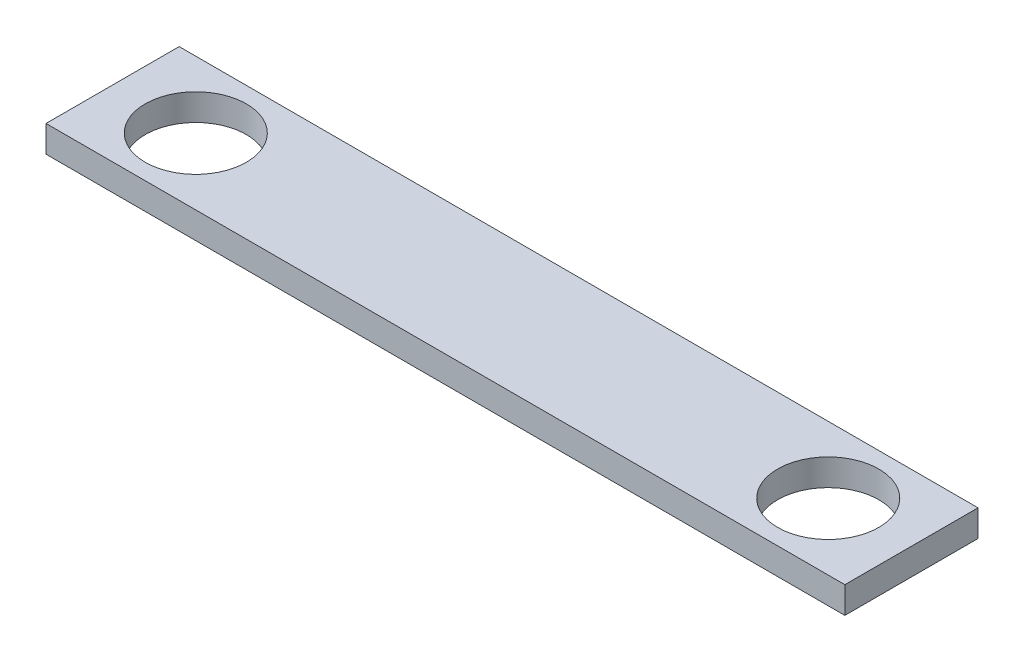
ISO-10303-21;
HEADER;
FILE_DESCRIPTION(('STEP AP214'),'2;1');
FILE_NAME('part.step','',(''),(''),'','','');
FILE_SCHEMA(('AUTOMOTIVE_DESIGN { 1 0 10303 214 1 1 1 1 }'));
ENDSEC;
DATA;
#1=APPLICATION_CONTEXT('core data for automotive mechanical design processes');
#2=APPLICATION_PROTOCOL_DEFINITION('international standard','automotive_design',2000,#1);
#3=PRODUCT_CONTEXT('',#1,'mechanical');
#4=PRODUCT('Part','Part','',(#3));
#5=PRODUCT_RELATED_PRODUCT_CATEGORY('part','',(#4));
#6=PRODUCT_DEFINITION_FORMATION('','',#4);
#7=PRODUCT_DEFINITION_CONTEXT('part definition',#1,'design');
#8=PRODUCT_DEFINITION('design','',#6,#7);
#9=PRODUCT_DEFINITION_SHAPE('','',#8);
#10=(LENGTH_UNIT() NAMED_UNIT(*) SI_UNIT(.MILLI.,.METRE.));
#11=(NAMED_UNIT(*) PLANE_ANGLE_UNIT() SI_UNIT($,.RADIAN.));
#12=(NAMED_UNIT(*) SI_UNIT($,.STERADIAN.) SOLID_ANGLE_UNIT());
#13=UNCERTAINTY_MEASURE_WITH_UNIT(LENGTH_MEASURE(1.E-05),#10,'distance_accuracy_value','');
#14=(GEOMETRIC_REPRESENTATION_CONTEXT(3) GLOBAL_UNCERTAINTY_ASSIGNED_CONTEXT((#13)) GLOBAL_UNIT_ASSIGNED_CONTEXT((#10,
#11,#12)) REPRESENTATION_CONTEXT('',''));
#15=CARTESIAN_POINT('',(0.,0.,0.));
#16=DIRECTION('',(0.,0.,1.));
#17=DIRECTION('',(1.,0.,0.));
#18=AXIS2_PLACEMENT_3D('',#15,#16,#17);
#19=CARTESIAN_POINT('',(0.,2.54,0.));
#20=DIRECTION('',(0.,-1.,0.));
#21=DIRECTION('',(0.,0.,-1.));
#22=AXIS2_PLACEMENT_3D('',#19,#20,#21);
#23=PLANE('',#22);
#24=DIRECTION('',(0.,0.,1.));
#25=VECTOR('',#24,1.);
#26=CARTESIAN_POINT('',(0.,2.54,0.));
#27=LINE('',#26,#25);
#28=CARTESIAN_POINT('',(0.,2.54,-12.7));
#29=VERTEX_POINT('',#28);
#30=CARTESIAN_POINT('',(0.,2.54,0.));
#31=VERTEX_POINT('',#30);
#32=EDGE_CURVE('E93',#29,#31,#27,.T.);
#33=ORIENTED_EDGE('',*,*,#32,.T.);
#34=DIRECTION('',(1.,0.,0.));
#35=VECTOR('',#34,1.);
#36=CARTESIAN_POINT('',(0.,2.54,0.));
#37=LINE('',#36,#35);
#38=CARTESIAN_POINT('',(76.2,2.54,0.));
#39=VERTEX_POINT('',#38);
#40=EDGE_CURVE('E88',#31,#39,#37,.T.);
#41=ORIENTED_EDGE('',*,*,#40,.T.);
#42=DIRECTION('',(0.,0.,-1.));
#43=VECTOR('',#42,1.);
#44=CARTESIAN_POINT('',(76.2,2.54,0.));
#45=LINE('',#44,#43);
#46=CARTESIAN_POINT('',(76.2,2.54,-12.7));
#47=VERTEX_POINT('',#46);
#48=EDGE_CURVE('E91',#39,#47,#45,.T.);
#49=ORIENTED_EDGE('',*,*,#48,.T.);
#50=DIRECTION('',(-1.,0.,0.));
#51=VECTOR('',#50,1.);
#52=CARTESIAN_POINT('',(0.,2.54,-12.7));
#53=LINE('',#52,#51);
#54=EDGE_CURVE('E58',#47,#29,#53,.T.);
#55=ORIENTED_EDGE('',*,*,#54,.T.);
#56=EDGE_LOOP('',(#33,#41,#49,#55));
#57=FACE_BOUND('',#56,.T.);
#58=CARTESIAN_POINT('',(7.9375,2.54,-6.35000000000001));
#59=DIRECTION('',(0.,1.,0.));
#60=DIRECTION('',(0.,0.,1.));
#61=AXIS2_PLACEMENT_3D('',#58,#59,#60);
#62=CIRCLE('',#61,4.826);
#63=CARTESIAN_POINT('',(7.9375,2.54,-1.52400000000001));
#64=VERTEX_POINT('',#63);
#65=EDGE_CURVE('E108',#64,#64,#62,.T.);
#66=ORIENTED_EDGE('',*,*,#65,.F.);
#67=EDGE_LOOP('',(#66));
#68=FACE_BOUND('',#67,.T.);
#69=CARTESIAN_POINT('',(68.2625,2.54,-6.35000000000001));
#70=DIRECTION('',(0.,1.,0.));
#71=DIRECTION('',(0.,0.,1.));
#72=AXIS2_PLACEMENT_3D('',#69,#70,#71);
#73=CIRCLE('',#72,4.82599999999999);
#74=CARTESIAN_POINT('',(68.2625,2.54,-1.52400000000002));
#75=VERTEX_POINT('',#74);
#76=EDGE_CURVE('E123',#75,#75,#73,.T.);
#77=ORIENTED_EDGE('',*,*,#76,.F.);
#78=EDGE_LOOP('',(#77));
#79=FACE_BOUND('',#78,.T.);
#80=ADVANCED_FACE('F41',(#57,#68,#79),#23,.F.);
#81=CARTESIAN_POINT('',(0.,0.,0.));
#82=DIRECTION('',(0.,-1.,0.));
#83=DIRECTION('',(0.,0.,-1.));
#84=AXIS2_PLACEMENT_3D('',#81,#82,#83);
#85=PLANE('',#84);
#86=CARTESIAN_POINT('',(7.9375,0.,-6.35000000000001));
#87=DIRECTION('',(0.,1.,0.));
#88=DIRECTION('',(0.,0.,1.));
#89=AXIS2_PLACEMENT_3D('',#86,#87,#88);
#90=CIRCLE('',#89,4.826);
#91=CARTESIAN_POINT('',(7.9375,0.,-1.52400000000001));
#92=VERTEX_POINT('',#91);
#93=EDGE_CURVE('E120',#92,#92,#90,.T.);
#94=ORIENTED_EDGE('',*,*,#93,.T.);
#95=EDGE_LOOP('',(#94));
#96=FACE_BOUND('',#95,.T.);
#97=DIRECTION('',(0.,0.,1.));
#98=VECTOR('',#97,1.);
#99=CARTESIAN_POINT('',(0.,0.,0.));
#100=LINE('',#99,#98);
#101=CARTESIAN_POINT('',(0.,0.,-12.7));
#102=VERTEX_POINT('',#101);
#103=CARTESIAN_POINT('',(0.,0.,0.));
#104=VERTEX_POINT('',#103);
#105=EDGE_CURVE('E105',#102,#104,#100,.T.);
#106=ORIENTED_EDGE('',*,*,#105,.F.);
#107=DIRECTION('',(-1.,0.,0.));
#108=VECTOR('',#107,1.);
#109=CARTESIAN_POINT('',(0.,0.,-12.7));
#110=LINE('',#109,#108);
#111=CARTESIAN_POINT('',(76.2,0.,-12.7));
#112=VERTEX_POINT('',#111);
#113=EDGE_CURVE('E81',#112,#102,#110,.T.);
#114=ORIENTED_EDGE('',*,*,#113,.F.);
#115=DIRECTION('',(0.,0.,-1.));
#116=VECTOR('',#115,1.);
#117=CARTESIAN_POINT('',(76.2,0.,0.));
#118=LINE('',#117,#116);
#119=CARTESIAN_POINT('',(76.2,0.,0.));
#120=VERTEX_POINT('',#119);
#121=EDGE_CURVE('E75',#120,#112,#118,.T.);
#122=ORIENTED_EDGE('',*,*,#121,.F.);
#123=DIRECTION('',(1.,0.,0.));
#124=VECTOR('',#123,1.);
#125=CARTESIAN_POINT('',(0.,0.,0.));
#126=LINE('',#125,#124);
#127=EDGE_CURVE('E97',#104,#120,#126,.T.);
#128=ORIENTED_EDGE('',*,*,#127,.F.);
#129=EDGE_LOOP('',(#106,#114,#122,#128));
#130=FACE_BOUND('',#129,.T.);
#131=CARTESIAN_POINT('',(68.2625,0.,-6.35000000000001));
#132=DIRECTION('',(0.,1.,0.));
#133=DIRECTION('',(0.,0.,1.));
#134=AXIS2_PLACEMENT_3D('',#131,#132,#133);
#135=CIRCLE('',#134,4.82599999999999);
#136=CARTESIAN_POINT('',(68.2625,0.,-1.52400000000002));
#137=VERTEX_POINT('',#136);
#138=EDGE_CURVE('E126',#137,#137,#135,.T.);
#139=ORIENTED_EDGE('',*,*,#138,.T.);
#140=EDGE_LOOP('',(#139));
#141=FACE_BOUND('',#140,.T.);
#142=ADVANCED_FACE('F116',(#96,#130,#141),#85,.T.);
#143=CARTESIAN_POINT('',(0.,2.54,0.));
#144=DIRECTION('',(1.,0.,0.));
#145=DIRECTION('',(0.,0.,-1.));
#146=AXIS2_PLACEMENT_3D('',#143,#144,#145);
#147=PLANE('',#146);
#148=ORIENTED_EDGE('',*,*,#105,.T.);
#149=DIRECTION('',(0.,-1.,0.));
#150=VECTOR('',#149,1.);
#151=CARTESIAN_POINT('',(0.,2.54,0.));
#152=LINE('',#151,#150);
#153=EDGE_CURVE('E11',#31,#104,#152,.T.);
#154=ORIENTED_EDGE('',*,*,#153,.F.);
#155=ORIENTED_EDGE('',*,*,#32,.F.);
#156=DIRECTION('',(0.,-1.,0.));
#157=VECTOR('',#156,1.);
#158=CARTESIAN_POINT('',(0.,2.54,-12.7));
#159=LINE('',#158,#157);
#160=EDGE_CURVE('E101',#29,#102,#159,.T.);
#161=ORIENTED_EDGE('',*,*,#160,.T.);
#162=EDGE_LOOP('',(#148,#154,#155,#161));
#163=FACE_BOUND('',#162,.T.);
#164=ADVANCED_FACE('F43',(#163),#147,.F.);
#165=CARTESIAN_POINT('',(0.,2.54,0.));
#166=DIRECTION('',(0.,0.,-1.));
#167=DIRECTION('',(-1.,0.,0.));
#168=AXIS2_PLACEMENT_3D('',#165,#166,#167);
#169=PLANE('',#168);
#170=ORIENTED_EDGE('',*,*,#127,.T.);
#171=DIRECTION('',(0.,-1.,0.));
#172=VECTOR('',#171,1.);
#173=CARTESIAN_POINT('',(76.2,2.54,0.));
#174=LINE('',#173,#172);
#175=EDGE_CURVE('E50',#39,#120,#174,.T.);
#176=ORIENTED_EDGE('',*,*,#175,.F.);
#177=ORIENTED_EDGE('',*,*,#40,.F.);
#178=ORIENTED_EDGE('',*,*,#153,.T.);
#179=EDGE_LOOP('',(#170,#176,#177,#178));
#180=FACE_BOUND('',#179,.T.);
#181=ADVANCED_FACE('F96',(#180),#169,.F.);
#182=CARTESIAN_POINT('',(76.2,2.54,0.));
#183=DIRECTION('',(-1.,0.,0.));
#184=DIRECTION('',(0.,0.,1.));
#185=AXIS2_PLACEMENT_3D('',#182,#183,#184);
#186=PLANE('',#185);
#187=ORIENTED_EDGE('',*,*,#121,.T.);
#188=DIRECTION('',(0.,-1.,0.));
#189=VECTOR('',#188,1.);
#190=CARTESIAN_POINT('',(76.2,2.54,-12.7));
#191=LINE('',#190,#189);
#192=EDGE_CURVE('E98',#47,#112,#191,.T.);
#193=ORIENTED_EDGE('',*,*,#192,.F.);
#194=ORIENTED_EDGE('',*,*,#48,.F.);
#195=ORIENTED_EDGE('',*,*,#175,.T.);
#196=EDGE_LOOP('',(#187,#193,#194,#195));
#197=FACE_BOUND('',#196,.T.);
#198=ADVANCED_FACE('F99',(#197),#186,.F.);
#199=CARTESIAN_POINT('',(0.,2.54,-12.7));
#200=DIRECTION('',(0.,0.,1.));
#201=DIRECTION('',(1.,0.,0.));
#202=AXIS2_PLACEMENT_3D('',#199,#200,#201);
#203=PLANE('',#202);
#204=ORIENTED_EDGE('',*,*,#113,.T.);
#205=ORIENTED_EDGE('',*,*,#160,.F.);
#206=ORIENTED_EDGE('',*,*,#54,.F.);
#207=ORIENTED_EDGE('',*,*,#192,.T.);
#208=EDGE_LOOP('',(#204,#205,#206,#207));
#209=FACE_BOUND('',#208,.T.);
#210=ADVANCED_FACE('F113',(#209),#203,.F.);
#211=CARTESIAN_POINT('',(7.9375,2.54,-6.35000000000001));
#212=DIRECTION('',(0.,-1.,0.));
#213=DIRECTION('',(0.,0.,-1.));
#214=AXIS2_PLACEMENT_3D('',#211,#212,#213);
#215=CYLINDRICAL_SURFACE('',#214,4.826);
#216=ORIENTED_EDGE('',*,*,#65,.T.);
#217=EDGE_LOOP('',(#216));
#218=FACE_BOUND('',#217,.T.);
#219=ORIENTED_EDGE('',*,*,#93,.F.);
#220=EDGE_LOOP('',(#219));
#221=FACE_BOUND('',#220,.T.);
#222=ADVANCED_FACE('F143',(#218,#221),#215,.F.);
#223=CARTESIAN_POINT('',(68.2625,2.54,-6.35000000000001));
#224=DIRECTION('',(0.,-1.,0.));
#225=DIRECTION('',(0.,0.,-1.));
#226=AXIS2_PLACEMENT_3D('',#223,#224,#225);
#227=CYLINDRICAL_SURFACE('',#226,4.82599999999999);
#228=ORIENTED_EDGE('',*,*,#76,.T.);
#229=EDGE_LOOP('',(#228));
#230=FACE_BOUND('',#229,.T.);
#231=ORIENTED_EDGE('',*,*,#138,.F.);
#232=EDGE_LOOP('',(#231));
#233=FACE_BOUND('',#232,.T.);
#234=ADVANCED_FACE('F132',(#230,#233),#227,.F.);
#235=CLOSED_SHELL('',(#80,#142,#164,#181,#198,#210,#222,#234));
#236=MANIFOLD_SOLID_BREP('B2',#235);
#237=ADVANCED_BREP_SHAPE_REPRESENTATION('',(#18,#236),#14);
#238=SHAPE_DEFINITION_REPRESENTATION(#9,#237);
ENDSEC;
END-ISO-10303-21;
